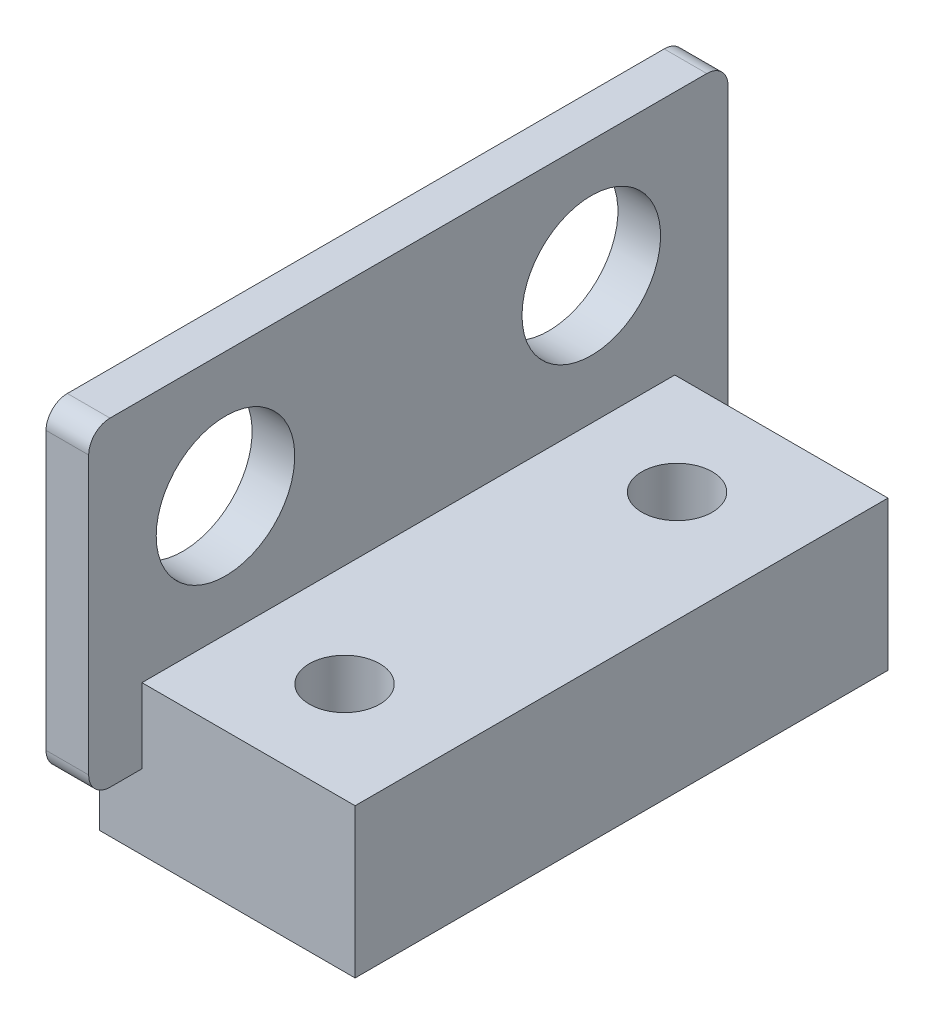
ISO-10303-21;
HEADER;
FILE_DESCRIPTION(('STEP AP214'),'2;1');
FILE_NAME('part.step','',(''),(''),'','','');
FILE_SCHEMA(('AUTOMOTIVE_DESIGN { 1 0 10303 214 1 1 1 1 }'));
ENDSEC;
DATA;
#1=APPLICATION_CONTEXT('core data for automotive mechanical design processes');
#2=APPLICATION_PROTOCOL_DEFINITION('international standard','automotive_design',2000,#1);
#3=PRODUCT_CONTEXT('',#1,'mechanical');
#4=PRODUCT('Part','Part','',(#3));
#5=PRODUCT_RELATED_PRODUCT_CATEGORY('part','',(#4));
#6=PRODUCT_DEFINITION_FORMATION('','',#4);
#7=PRODUCT_DEFINITION_CONTEXT('part definition',#1,'design');
#8=PRODUCT_DEFINITION('design','',#6,#7);
#9=PRODUCT_DEFINITION_SHAPE('','',#8);
#10=(LENGTH_UNIT() NAMED_UNIT(*) SI_UNIT(.MILLI.,.METRE.));
#11=(NAMED_UNIT(*) PLANE_ANGLE_UNIT() SI_UNIT($,.RADIAN.));
#12=(NAMED_UNIT(*) SI_UNIT($,.STERADIAN.) SOLID_ANGLE_UNIT());
#13=UNCERTAINTY_MEASURE_WITH_UNIT(LENGTH_MEASURE(1.E-05),#10,'distance_accuracy_value','');
#14=(GEOMETRIC_REPRESENTATION_CONTEXT(3) GLOBAL_UNCERTAINTY_ASSIGNED_CONTEXT((#13)) GLOBAL_UNIT_ASSIGNED_CONTEXT((#10,
#11,#12)) REPRESENTATION_CONTEXT('',''));
#15=CARTESIAN_POINT('',(0.,0.,0.));
#16=DIRECTION('',(0.,0.,1.));
#17=DIRECTION('',(1.,0.,0.));
#18=AXIS2_PLACEMENT_3D('',#15,#16,#17);
#19=CARTESIAN_POINT('',(0.804958277186399,3.5,7.80000000000001));
#20=DIRECTION('',(0.,-1.,0.));
#21=DIRECTION('',(0.,0.,-1.));
#22=AXIS2_PLACEMENT_3D('',#19,#20,#21);
#23=CYLINDRICAL_SURFACE('',#22,1.65);
#24=CARTESIAN_POINT('',(0.804958277186399,3.5,7.80000000000001));
#25=DIRECTION('',(0.,1.,0.));
#26=DIRECTION('',(0.,0.,1.));
#27=AXIS2_PLACEMENT_3D('',#24,#25,#26);
#28=CIRCLE('',#27,1.65);
#29=CARTESIAN_POINT('',(0.804958277186399,3.5,9.45));
#30=VERTEX_POINT('',#29);
#31=EDGE_CURVE('E392',#30,#30,#28,.T.);
#32=ORIENTED_EDGE('',*,*,#31,.T.);
#33=EDGE_LOOP('',(#32));
#34=FACE_BOUND('',#33,.T.);
#35=CARTESIAN_POINT('',(0.804958277186399,0.,7.80000000000001));
#36=DIRECTION('',(0.,-1.,0.));
#37=DIRECTION('',(0.,0.,-1.));
#38=AXIS2_PLACEMENT_3D('',#35,#36,#37);
#39=CIRCLE('',#38,1.65);
#40=CARTESIAN_POINT('',(0.804958277186399,0.,6.15));
#41=VERTEX_POINT('',#40);
#42=EDGE_CURVE('E393',#41,#41,#39,.T.);
#43=ORIENTED_EDGE('',*,*,#42,.T.);
#44=EDGE_LOOP('',(#43));
#45=FACE_BOUND('',#44,.T.);
#46=ADVANCED_FACE('F34',(#34,#45),#23,.F.);
#47=CARTESIAN_POINT('',(0.804958277186399,3.5,-7.80000000000001));
#48=DIRECTION('',(0.,-1.,0.));
#49=DIRECTION('',(0.,0.,-1.));
#50=AXIS2_PLACEMENT_3D('',#47,#48,#49);
#51=CYLINDRICAL_SURFACE('',#50,1.65);
#52=CARTESIAN_POINT('',(0.804958277186399,3.5,-7.80000000000001));
#53=DIRECTION('',(0.,1.,0.));
#54=DIRECTION('',(0.,0.,-1.));
#55=AXIS2_PLACEMENT_3D('',#52,#53,#54);
#56=CIRCLE('',#55,1.65);
#57=CARTESIAN_POINT('',(0.804958277186399,3.5,-9.45));
#58=VERTEX_POINT('',#57);
#59=EDGE_CURVE('E389',#58,#58,#56,.T.);
#60=ORIENTED_EDGE('',*,*,#59,.T.);
#61=EDGE_LOOP('',(#60));
#62=FACE_BOUND('',#61,.T.);
#63=CARTESIAN_POINT('',(0.804958277186399,0.,-7.80000000000001));
#64=DIRECTION('',(0.,-1.,0.));
#65=DIRECTION('',(0.,0.,-1.));
#66=AXIS2_PLACEMENT_3D('',#63,#64,#65);
#67=CIRCLE('',#66,1.65);
#68=CARTESIAN_POINT('',(0.804958277186399,0.,-9.45));
#69=VERTEX_POINT('',#68);
#70=EDGE_CURVE('E332',#69,#69,#67,.T.);
#71=ORIENTED_EDGE('',*,*,#70,.T.);
#72=EDGE_LOOP('',(#71));
#73=FACE_BOUND('',#72,.T.);
#74=ADVANCED_FACE('F507',(#62,#73),#51,.F.);
#75=CARTESIAN_POINT('',(0.,3.5,0.));
#76=DIRECTION('',(0.,1.,0.));
#77=DIRECTION('',(0.,0.,1.));
#78=AXIS2_PLACEMENT_3D('',#75,#76,#77);
#79=PLANE('',#78);
#80=DIRECTION('',(0.,0.,-1.));
#81=VECTOR('',#80,1.);
#82=CARTESIAN_POINT('',(-4.,3.5,0.));
#83=LINE('',#82,#81);
#84=CARTESIAN_POINT('',(-4.,3.5,12.5));
#85=VERTEX_POINT('',#84);
#86=CARTESIAN_POINT('',(-4.,3.5,-12.5));
#87=VERTEX_POINT('',#86);
#88=EDGE_CURVE('E276',#85,#87,#83,.T.);
#89=ORIENTED_EDGE('',*,*,#88,.F.);
#90=DIRECTION('',(1.,0.,0.));
#91=VECTOR('',#90,1.);
#92=CARTESIAN_POINT('',(-6.,3.5,12.5));
#93=LINE('',#92,#91);
#94=CARTESIAN_POINT('',(6.,3.5,12.5));
#95=VERTEX_POINT('',#94);
#96=EDGE_CURVE('E403',#85,#95,#93,.T.);
#97=ORIENTED_EDGE('',*,*,#96,.T.);
#98=DIRECTION('',(0.,0.,-1.));
#99=VECTOR('',#98,1.);
#100=CARTESIAN_POINT('',(6.,3.5,-12.5));
#101=LINE('',#100,#99);
#102=CARTESIAN_POINT('',(6.,3.5,-12.5));
#103=VERTEX_POINT('',#102);
#104=EDGE_CURVE('E397',#95,#103,#101,.T.);
#105=ORIENTED_EDGE('',*,*,#104,.T.);
#106=DIRECTION('',(-1.,0.,0.));
#107=VECTOR('',#106,1.);
#108=CARTESIAN_POINT('',(-6.,3.5,-12.5));
#109=LINE('',#108,#107);
#110=EDGE_CURVE('E400',#103,#87,#109,.T.);
#111=ORIENTED_EDGE('',*,*,#110,.T.);
#112=EDGE_LOOP('',(#89,#97,#105,#111));
#113=FACE_BOUND('',#112,.T.);
#114=ORIENTED_EDGE('',*,*,#31,.F.);
#115=EDGE_LOOP('',(#114));
#116=FACE_BOUND('',#115,.T.);
#117=ORIENTED_EDGE('',*,*,#59,.F.);
#118=EDGE_LOOP('',(#117));
#119=FACE_BOUND('',#118,.T.);
#120=ADVANCED_FACE('F433',(#113,#116,#119),#79,.T.);
#121=CARTESIAN_POINT('',(0.,-3.5,0.));
#122=DIRECTION('',(0.,1.,0.));
#123=DIRECTION('',(0.,0.,1.));
#124=AXIS2_PLACEMENT_3D('',#121,#122,#123);
#125=PLANE('',#124);
#126=DIRECTION('',(0.499999999999999,0.,0.866025403784439));
#127=VECTOR('',#126,1.);
#128=CARTESIAN_POINT('',(2.6524791385932,-3.5,4.60000000000001));
#129=LINE('',#128,#127);
#130=CARTESIAN_POINT('',(2.6524791385932,-3.5,4.60000000000001));
#131=VERTEX_POINT('',#130);
#132=CARTESIAN_POINT('',(4.5,-3.5,7.80000000000001));
#133=VERTEX_POINT('',#132);
#134=EDGE_CURVE('E315',#131,#133,#129,.T.);
#135=ORIENTED_EDGE('',*,*,#134,.F.);
#136=DIRECTION('',(1.,0.,0.));
#137=VECTOR('',#136,1.);
#138=CARTESIAN_POINT('',(-1.04256258422037,-3.5,4.59999999999999));
#139=LINE('',#138,#137);
#140=CARTESIAN_POINT('',(-1.04256258422037,-3.5,4.59999999999999));
#141=VERTEX_POINT('',#140);
#142=EDGE_CURVE('E313',#141,#131,#139,.T.);
#143=ORIENTED_EDGE('',*,*,#142,.F.);
#144=DIRECTION('',(0.500000000000009,0.,-0.866025403784433));
#145=VECTOR('',#144,1.);
#146=CARTESIAN_POINT('',(-2.8900834456272,-3.5,7.79999999999997));
#147=LINE('',#146,#145);
#148=CARTESIAN_POINT('',(-2.8900834456272,-3.5,7.79999999999997));
#149=VERTEX_POINT('',#148);
#150=EDGE_CURVE('E297',#149,#141,#147,.T.);
#151=ORIENTED_EDGE('',*,*,#150,.F.);
#152=DIRECTION('',(-0.499999999999993,0.,-0.866025403784443));
#153=VECTOR('',#152,1.);
#154=CARTESIAN_POINT('',(-1.04256258422042,-3.5,11.));
#155=LINE('',#154,#153);
#156=CARTESIAN_POINT('',(-1.04256258422042,-3.5,11.));
#157=VERTEX_POINT('',#156);
#158=EDGE_CURVE('E325',#157,#149,#155,.T.);
#159=ORIENTED_EDGE('',*,*,#158,.F.);
#160=DIRECTION('',(-1.,0.,0.));
#161=VECTOR('',#160,1.);
#162=CARTESIAN_POINT('',(2.65247913859319,-3.5,11.));
#163=LINE('',#162,#161);
#164=CARTESIAN_POINT('',(2.65247913859319,-3.5,11.));
#165=VERTEX_POINT('',#164);
#166=EDGE_CURVE('E322',#165,#157,#163,.T.);
#167=ORIENTED_EDGE('',*,*,#166,.F.);
#168=DIRECTION('',(-0.500000000000003,0.,0.866025403784437));
#169=VECTOR('',#168,1.);
#170=CARTESIAN_POINT('',(4.5,-3.5,7.80000000000001));
#171=LINE('',#170,#169);
#172=EDGE_CURVE('E319',#133,#165,#171,.T.);
#173=ORIENTED_EDGE('',*,*,#172,.F.);
#174=EDGE_LOOP('',(#135,#143,#151,#159,#167,#173));
#175=FACE_BOUND('',#174,.T.);
#176=DIRECTION('',(0.499999999999999,0.,0.866025403784439));
#177=VECTOR('',#176,1.);
#178=CARTESIAN_POINT('',(2.6524791385932,-3.5,-11.));
#179=LINE('',#178,#177);
#180=CARTESIAN_POINT('',(2.6524791385932,-3.5,-11.));
#181=VERTEX_POINT('',#180);
#182=CARTESIAN_POINT('',(4.5,-3.5,-7.8));
#183=VERTEX_POINT('',#182);
#184=EDGE_CURVE('E364',#181,#183,#179,.T.);
#185=ORIENTED_EDGE('',*,*,#184,.F.);
#186=DIRECTION('',(1.,0.,0.));
#187=VECTOR('',#186,1.);
#188=CARTESIAN_POINT('',(-1.04256258422036,-3.5,-11.));
#189=LINE('',#188,#187);
#190=CARTESIAN_POINT('',(-1.04256258422036,-3.5,-11.));
#191=VERTEX_POINT('',#190);
#192=EDGE_CURVE('E292',#191,#181,#189,.T.);
#193=ORIENTED_EDGE('',*,*,#192,.F.);
#194=DIRECTION('',(0.500000000000009,0.,-0.866025403784433));
#195=VECTOR('',#194,1.);
#196=CARTESIAN_POINT('',(-2.8900834456272,-3.5,-7.80000000000004));
#197=LINE('',#196,#195);
#198=CARTESIAN_POINT('',(-2.8900834456272,-3.5,-7.80000000000004));
#199=VERTEX_POINT('',#198);
#200=EDGE_CURVE('E347',#199,#191,#197,.T.);
#201=ORIENTED_EDGE('',*,*,#200,.F.);
#202=DIRECTION('',(-0.499999999999993,0.,-0.866025403784443));
#203=VECTOR('',#202,1.);
#204=CARTESIAN_POINT('',(-1.04256258422042,-3.5,-4.60000000000002));
#205=LINE('',#204,#203);
#206=CARTESIAN_POINT('',(-1.04256258422042,-3.5,-4.60000000000002));
#207=VERTEX_POINT('',#206);
#208=EDGE_CURVE('E373',#207,#199,#205,.T.);
#209=ORIENTED_EDGE('',*,*,#208,.F.);
#210=DIRECTION('',(-1.,0.,0.));
#211=VECTOR('',#210,1.);
#212=CARTESIAN_POINT('',(2.65247913859319,-3.5,-4.6));
#213=LINE('',#212,#211);
#214=CARTESIAN_POINT('',(2.65247913859319,-3.5,-4.6));
#215=VERTEX_POINT('',#214);
#216=EDGE_CURVE('E370',#215,#207,#213,.T.);
#217=ORIENTED_EDGE('',*,*,#216,.F.);
#218=DIRECTION('',(-0.500000000000003,0.,0.866025403784437));
#219=VECTOR('',#218,1.);
#220=CARTESIAN_POINT('',(4.5,-3.5,-7.8));
#221=LINE('',#220,#219);
#222=EDGE_CURVE('E367',#183,#215,#221,.T.);
#223=ORIENTED_EDGE('',*,*,#222,.F.);
#224=EDGE_LOOP('',(#185,#193,#201,#209,#217,#223));
#225=FACE_BOUND('',#224,.T.);
#226=DIRECTION('',(0.,0.,-1.));
#227=VECTOR('',#226,1.);
#228=CARTESIAN_POINT('',(6.,-3.5,-12.5));
#229=LINE('',#228,#227);
#230=CARTESIAN_POINT('',(6.,-3.5,12.5));
#231=VERTEX_POINT('',#230);
#232=CARTESIAN_POINT('',(6.,-3.5,-12.5));
#233=VERTEX_POINT('',#232);
#234=EDGE_CURVE('E396',#231,#233,#229,.T.);
#235=ORIENTED_EDGE('',*,*,#234,.F.);
#236=DIRECTION('',(1.,0.,0.));
#237=VECTOR('',#236,1.);
#238=CARTESIAN_POINT('',(-6.,-3.5,12.5));
#239=LINE('',#238,#237);
#240=CARTESIAN_POINT('',(-6.,-3.5,12.5));
#241=VERTEX_POINT('',#240);
#242=EDGE_CURVE('E401',#241,#231,#239,.T.);
#243=ORIENTED_EDGE('',*,*,#242,.F.);
#244=DIRECTION('',(0.,0.,1.));
#245=VECTOR('',#244,1.);
#246=CARTESIAN_POINT('',(-6.,-3.5,-12.5));
#247=LINE('',#246,#245);
#248=CARTESIAN_POINT('',(-6.,-3.5,-12.5));
#249=VERTEX_POINT('',#248);
#250=EDGE_CURVE('E411',#249,#241,#247,.T.);
#251=ORIENTED_EDGE('',*,*,#250,.F.);
#252=DIRECTION('',(-1.,0.,0.));
#253=VECTOR('',#252,1.);
#254=CARTESIAN_POINT('',(-6.,-3.5,-12.5));
#255=LINE('',#254,#253);
#256=EDGE_CURVE('E408',#233,#249,#255,.T.);
#257=ORIENTED_EDGE('',*,*,#256,.F.);
#258=EDGE_LOOP('',(#235,#243,#251,#257));
#259=FACE_BOUND('',#258,.T.);
#260=ADVANCED_FACE('F443',(#175,#225,#259),#125,.F.);
#261=CARTESIAN_POINT('',(6.,3.5,-12.5));
#262=DIRECTION('',(-1.,0.,0.));
#263=DIRECTION('',(0.,0.,1.));
#264=AXIS2_PLACEMENT_3D('',#261,#262,#263);
#265=PLANE('',#264);
#266=ORIENTED_EDGE('',*,*,#234,.T.);
#267=DIRECTION('',(0.,-1.,0.));
#268=VECTOR('',#267,1.);
#269=CARTESIAN_POINT('',(6.,3.5,-12.5));
#270=LINE('',#269,#268);
#271=EDGE_CURVE('E421',#103,#233,#270,.T.);
#272=ORIENTED_EDGE('',*,*,#271,.F.);
#273=ORIENTED_EDGE('',*,*,#104,.F.);
#274=DIRECTION('',(0.,-1.,0.));
#275=VECTOR('',#274,1.);
#276=CARTESIAN_POINT('',(6.,3.5,12.5));
#277=LINE('',#276,#275);
#278=EDGE_CURVE('E405',#95,#231,#277,.T.);
#279=ORIENTED_EDGE('',*,*,#278,.T.);
#280=EDGE_LOOP('',(#266,#272,#273,#279));
#281=FACE_BOUND('',#280,.T.);
#282=ADVANCED_FACE('F36',(#281),#265,.F.);
#283=CARTESIAN_POINT('',(-6.,3.5,-12.5));
#284=DIRECTION('',(0.,0.,1.));
#285=DIRECTION('',(1.,0.,0.));
#286=AXIS2_PLACEMENT_3D('',#283,#284,#285);
#287=PLANE('',#286);
#288=DIRECTION('',(0.,-1.,0.));
#289=VECTOR('',#288,1.);
#290=CARTESIAN_POINT('',(-6.,3.5,-12.5));
#291=LINE('',#290,#289);
#292=CARTESIAN_POINT('',(-6.,0.,-12.5));
#293=VERTEX_POINT('',#292);
#294=EDGE_CURVE('E419',#293,#249,#291,.T.);
#295=ORIENTED_EDGE('',*,*,#294,.F.);
#296=DIRECTION('',(1.,0.,0.));
#297=VECTOR('',#296,1.);
#298=CARTESIAN_POINT('',(-6.,0.,-12.5));
#299=LINE('',#298,#297);
#300=CARTESIAN_POINT('',(-4.,0.,-12.5));
#301=VERTEX_POINT('',#300);
#302=EDGE_CURVE('E49',#293,#301,#299,.T.);
#303=ORIENTED_EDGE('',*,*,#302,.T.);
#304=DIRECTION('',(0.,1.,0.));
#305=VECTOR('',#304,1.);
#306=CARTESIAN_POINT('',(-4.,3.5,-12.5));
#307=LINE('',#306,#305);
#308=EDGE_CURVE('E53',#301,#87,#307,.T.);
#309=ORIENTED_EDGE('',*,*,#308,.T.);
#310=ORIENTED_EDGE('',*,*,#110,.F.);
#311=ORIENTED_EDGE('',*,*,#271,.T.);
#312=ORIENTED_EDGE('',*,*,#256,.T.);
#313=EDGE_LOOP('',(#295,#303,#309,#310,#311,#312));
#314=FACE_BOUND('',#313,.T.);
#315=ADVANCED_FACE('F437',(#314),#287,.F.);
#316=CARTESIAN_POINT('',(-6.,3.5,-12.5));
#317=DIRECTION('',(1.,0.,0.));
#318=DIRECTION('',(0.,0.,-1.));
#319=AXIS2_PLACEMENT_3D('',#316,#317,#318);
#320=PLANE('',#319);
#321=DIRECTION('',(0.,0.,1.));
#322=VECTOR('',#321,1.);
#323=CARTESIAN_POINT('',(-6.,0.,0.));
#324=LINE('',#323,#322);
#325=CARTESIAN_POINT('',(-6.,0.,-14.));
#326=VERTEX_POINT('',#325);
#327=EDGE_CURVE('E251',#326,#293,#324,.T.);
#328=ORIENTED_EDGE('',*,*,#327,.T.);
#329=ORIENTED_EDGE('',*,*,#294,.T.);
#330=ORIENTED_EDGE('',*,*,#250,.T.);
#331=DIRECTION('',(0.,-1.,0.));
#332=VECTOR('',#331,1.);
#333=CARTESIAN_POINT('',(-6.,3.5,12.5));
#334=LINE('',#333,#332);
#335=CARTESIAN_POINT('',(-6.,0.,12.5));
#336=VERTEX_POINT('',#335);
#337=EDGE_CURVE('E417',#336,#241,#334,.T.);
#338=ORIENTED_EDGE('',*,*,#337,.F.);
#339=CARTESIAN_POINT('',(-6.,0.,14.));
#340=VERTEX_POINT('',#339);
#341=EDGE_CURVE('E254',#336,#340,#324,.T.);
#342=ORIENTED_EDGE('',*,*,#341,.T.);
#343=CARTESIAN_POINT('',(-6.,1.,14.));
#344=DIRECTION('',(-1.,0.,0.));
#345=DIRECTION('',(0.,0.,1.));
#346=AXIS2_PLACEMENT_3D('',#343,#344,#345);
#347=CIRCLE('',#346,1.);
#348=CARTESIAN_POINT('',(-6.,1.,15.));
#349=VERTEX_POINT('',#348);
#350=EDGE_CURVE('E223',#340,#349,#347,.T.);
#351=ORIENTED_EDGE('',*,*,#350,.T.);
#352=DIRECTION('',(0.,1.,0.));
#353=VECTOR('',#352,1.);
#354=CARTESIAN_POINT('',(-6.,14.,15.));
#355=LINE('',#354,#353);
#356=CARTESIAN_POINT('',(-6.,14.,15.));
#357=VERTEX_POINT('',#356);
#358=EDGE_CURVE('E256',#349,#357,#355,.T.);
#359=ORIENTED_EDGE('',*,*,#358,.T.);
#360=CARTESIAN_POINT('',(-6.,14.,14.));
#361=DIRECTION('',(-1.,0.,0.));
#362=DIRECTION('',(0.,0.,-1.));
#363=AXIS2_PLACEMENT_3D('',#360,#361,#362);
#364=CIRCLE('',#363,0.999999999999999);
#365=CARTESIAN_POINT('',(-6.,15.,14.));
#366=VERTEX_POINT('',#365);
#367=EDGE_CURVE('E259',#357,#366,#364,.T.);
#368=ORIENTED_EDGE('',*,*,#367,.T.);
#369=DIRECTION('',(0.,0.,-1.));
#370=VECTOR('',#369,1.);
#371=CARTESIAN_POINT('',(-6.,15.,-14.));
#372=LINE('',#371,#370);
#373=CARTESIAN_POINT('',(-6.,15.,-14.));
#374=VERTEX_POINT('',#373);
#375=EDGE_CURVE('E262',#366,#374,#372,.T.);
#376=ORIENTED_EDGE('',*,*,#375,.T.);
#377=CARTESIAN_POINT('',(-6.,14.,-14.));
#378=DIRECTION('',(-1.,0.,0.));
#379=DIRECTION('',(0.,0.,-1.));
#380=AXIS2_PLACEMENT_3D('',#377,#378,#379);
#381=CIRCLE('',#380,0.999999999999999);
#382=CARTESIAN_POINT('',(-6.,14.,-15.));
#383=VERTEX_POINT('',#382);
#384=EDGE_CURVE('E265',#374,#383,#381,.T.);
#385=ORIENTED_EDGE('',*,*,#384,.T.);
#386=DIRECTION('',(0.,-1.,0.));
#387=VECTOR('',#386,1.);
#388=CARTESIAN_POINT('',(-6.,1.00000000000001,-15.));
#389=LINE('',#388,#387);
#390=CARTESIAN_POINT('',(-6.,1.00000000000001,-15.));
#391=VERTEX_POINT('',#390);
#392=EDGE_CURVE('E268',#383,#391,#389,.T.);
#393=ORIENTED_EDGE('',*,*,#392,.T.);
#394=CARTESIAN_POINT('',(-6.,0.999999999999998,-14.));
#395=DIRECTION('',(-1.,0.,0.));
#396=DIRECTION('',(0.,0.,-1.));
#397=AXIS2_PLACEMENT_3D('',#394,#395,#396);
#398=CIRCLE('',#397,1.);
#399=EDGE_CURVE('E216',#391,#326,#398,.T.);
#400=ORIENTED_EDGE('',*,*,#399,.T.);
#401=EDGE_LOOP('',(#328,#329,#330,#338,#342,#351,#359,#368,#376,#385,#393,#400));
#402=FACE_BOUND('',#401,.T.);
#403=CARTESIAN_POINT('',(-6.,9.12493936450424,8.58119784648299));
#404=DIRECTION('',(-1.,0.,0.));
#405=DIRECTION('',(0.,0.,1.));
#406=AXIS2_PLACEMENT_3D('',#403,#404,#405);
#407=CIRCLE('',#406,3.25);
#408=CARTESIAN_POINT('',(-6.,9.12493936450424,11.831197846483));
#409=VERTEX_POINT('',#408);
#410=EDGE_CURVE('E480',#409,#409,#407,.T.);
#411=ORIENTED_EDGE('',*,*,#410,.F.);
#412=EDGE_LOOP('',(#411));
#413=FACE_BOUND('',#412,.T.);
#414=CARTESIAN_POINT('',(-6.,9.5,-8.581197846483));
#415=DIRECTION('',(-1.,0.,0.));
#416=DIRECTION('',(0.,0.,1.));
#417=AXIS2_PLACEMENT_3D('',#414,#415,#416);
#418=CIRCLE('',#417,3.25);
#419=CARTESIAN_POINT('',(-6.,9.5,-5.331197846483));
#420=VERTEX_POINT('',#419);
#421=EDGE_CURVE('E473',#420,#420,#418,.T.);
#422=ORIENTED_EDGE('',*,*,#421,.F.);
#423=EDGE_LOOP('',(#422));
#424=FACE_BOUND('',#423,.T.);
#425=ADVANCED_FACE('F445',(#402,#413,#424),#320,.F.);
#426=CARTESIAN_POINT('',(-6.,3.5,12.5));
#427=DIRECTION('',(0.,0.,-1.));
#428=DIRECTION('',(-1.,0.,0.));
#429=AXIS2_PLACEMENT_3D('',#426,#427,#428);
#430=PLANE('',#429);
#431=DIRECTION('',(0.,-1.,0.));
#432=VECTOR('',#431,1.);
#433=CARTESIAN_POINT('',(-4.,3.5,12.5));
#434=LINE('',#433,#432);
#435=CARTESIAN_POINT('',(-4.,0.,12.5));
#436=VERTEX_POINT('',#435);
#437=EDGE_CURVE('E42',#85,#436,#434,.T.);
#438=ORIENTED_EDGE('',*,*,#437,.T.);
#439=DIRECTION('',(-1.,0.,0.));
#440=VECTOR('',#439,1.);
#441=CARTESIAN_POINT('',(-6.,0.,12.5));
#442=LINE('',#441,#440);
#443=EDGE_CURVE('E11',#436,#336,#442,.T.);
#444=ORIENTED_EDGE('',*,*,#443,.T.);
#445=ORIENTED_EDGE('',*,*,#337,.T.);
#446=ORIENTED_EDGE('',*,*,#242,.T.);
#447=ORIENTED_EDGE('',*,*,#278,.F.);
#448=ORIENTED_EDGE('',*,*,#96,.F.);
#449=EDGE_LOOP('',(#438,#444,#445,#446,#447,#448));
#450=FACE_BOUND('',#449,.T.);
#451=ADVANCED_FACE('F429',(#450),#430,.F.);
#452=CARTESIAN_POINT('',(-1.04256258422036,0.,-11.));
#453=DIRECTION('',(0.,0.,-1.));
#454=DIRECTION('',(-1.,0.,0.));
#455=AXIS2_PLACEMENT_3D('',#452,#453,#454);
#456=PLANE('',#455);
#457=ORIENTED_EDGE('',*,*,#192,.T.);
#458=DIRECTION('',(0.,-1.,0.));
#459=VECTOR('',#458,1.);
#460=CARTESIAN_POINT('',(2.6524791385932,0.,-11.));
#461=LINE('',#460,#459);
#462=CARTESIAN_POINT('',(2.6524791385932,0.,-11.));
#463=VERTEX_POINT('',#462);
#464=EDGE_CURVE('E362',#463,#181,#461,.T.);
#465=ORIENTED_EDGE('',*,*,#464,.F.);
#466=DIRECTION('',(1.,0.,0.));
#467=VECTOR('',#466,1.);
#468=CARTESIAN_POINT('',(-1.04256258422036,0.,-11.));
#469=LINE('',#468,#467);
#470=CARTESIAN_POINT('',(-1.04256258422036,0.,-11.));
#471=VERTEX_POINT('',#470);
#472=EDGE_CURVE('E343',#471,#463,#469,.T.);
#473=ORIENTED_EDGE('',*,*,#472,.F.);
#474=DIRECTION('',(0.,-1.,0.));
#475=VECTOR('',#474,1.);
#476=CARTESIAN_POINT('',(-1.04256258422036,0.,-11.));
#477=LINE('',#476,#475);
#478=EDGE_CURVE('E316',#471,#191,#477,.T.);
#479=ORIENTED_EDGE('',*,*,#478,.T.);
#480=EDGE_LOOP('',(#457,#465,#473,#479));
#481=FACE_BOUND('',#480,.T.);
#482=ADVANCED_FACE('F524',(#481),#456,.F.);
#483=CARTESIAN_POINT('',(-2.8900834456272,0.,-7.80000000000004));
#484=DIRECTION('',(-0.866025403784433,0.,-0.500000000000009));
#485=DIRECTION('',(-0.500000000000009,0.,0.866025403784433));
#486=AXIS2_PLACEMENT_3D('',#483,#484,#485);
#487=PLANE('',#486);
#488=ORIENTED_EDGE('',*,*,#200,.T.);
#489=ORIENTED_EDGE('',*,*,#478,.F.);
#490=DIRECTION('',(0.500000000000009,0.,-0.866025403784433));
#491=VECTOR('',#490,1.);
#492=CARTESIAN_POINT('',(-2.8900834456272,0.,-7.80000000000004));
#493=LINE('',#492,#491);
#494=CARTESIAN_POINT('',(-2.8900834456272,0.,-7.80000000000004));
#495=VERTEX_POINT('',#494);
#496=EDGE_CURVE('E359',#495,#471,#493,.T.);
#497=ORIENTED_EDGE('',*,*,#496,.F.);
#498=DIRECTION('',(0.,-1.,0.));
#499=VECTOR('',#498,1.);
#500=CARTESIAN_POINT('',(-2.8900834456272,0.,-7.80000000000004));
#501=LINE('',#500,#499);
#502=EDGE_CURVE('E379',#495,#199,#501,.T.);
#503=ORIENTED_EDGE('',*,*,#502,.T.);
#504=EDGE_LOOP('',(#488,#489,#497,#503));
#505=FACE_BOUND('',#504,.T.);
#506=ADVANCED_FACE('F559',(#505),#487,.F.);
#507=CARTESIAN_POINT('',(-1.04256258422042,0.,-4.60000000000002));
#508=DIRECTION('',(-0.866025403784443,0.,0.499999999999993));
#509=DIRECTION('',(0.499999999999993,0.,0.866025403784443));
#510=AXIS2_PLACEMENT_3D('',#507,#508,#509);
#511=PLANE('',#510);
#512=ORIENTED_EDGE('',*,*,#208,.T.);
#513=ORIENTED_EDGE('',*,*,#502,.F.);
#514=DIRECTION('',(-0.499999999999993,0.,-0.866025403784443));
#515=VECTOR('',#514,1.);
#516=CARTESIAN_POINT('',(-1.04256258422042,0.,-4.60000000000002));
#517=LINE('',#516,#515);
#518=CARTESIAN_POINT('',(-1.04256258422042,0.,-4.60000000000002));
#519=VERTEX_POINT('',#518);
#520=EDGE_CURVE('E356',#519,#495,#517,.T.);
#521=ORIENTED_EDGE('',*,*,#520,.F.);
#522=DIRECTION('',(0.,-1.,0.));
#523=VECTOR('',#522,1.);
#524=CARTESIAN_POINT('',(-1.04256258422042,0.,-4.60000000000002));
#525=LINE('',#524,#523);
#526=EDGE_CURVE('E381',#519,#207,#525,.T.);
#527=ORIENTED_EDGE('',*,*,#526,.T.);
#528=EDGE_LOOP('',(#512,#513,#521,#527));
#529=FACE_BOUND('',#528,.T.);
#530=ADVANCED_FACE('F567',(#529),#511,.F.);
#531=CARTESIAN_POINT('',(2.65247913859319,0.,-4.6));
#532=DIRECTION('',(0.,0.,1.));
#533=DIRECTION('',(1.,0.,0.));
#534=AXIS2_PLACEMENT_3D('',#531,#532,#533);
#535=PLANE('',#534);
#536=ORIENTED_EDGE('',*,*,#216,.T.);
#537=ORIENTED_EDGE('',*,*,#526,.F.);
#538=DIRECTION('',(-1.,0.,0.));
#539=VECTOR('',#538,1.);
#540=CARTESIAN_POINT('',(2.65247913859319,0.,-4.6));
#541=LINE('',#540,#539);
#542=CARTESIAN_POINT('',(2.65247913859319,0.,-4.6));
#543=VERTEX_POINT('',#542);
#544=EDGE_CURVE('E353',#543,#519,#541,.T.);
#545=ORIENTED_EDGE('',*,*,#544,.F.);
#546=DIRECTION('',(0.,-1.,0.));
#547=VECTOR('',#546,1.);
#548=CARTESIAN_POINT('',(2.65247913859319,0.,-4.6));
#549=LINE('',#548,#547);
#550=EDGE_CURVE('E383',#543,#215,#549,.T.);
#551=ORIENTED_EDGE('',*,*,#550,.T.);
#552=EDGE_LOOP('',(#536,#537,#545,#551));
#553=FACE_BOUND('',#552,.T.);
#554=ADVANCED_FACE('F576',(#553),#535,.F.);
#555=CARTESIAN_POINT('',(4.5,0.,-7.8));
#556=DIRECTION('',(0.866025403784437,0.,0.500000000000003));
#557=DIRECTION('',(0.500000000000003,0.,-0.866025403784437));
#558=AXIS2_PLACEMENT_3D('',#555,#556,#557);
#559=PLANE('',#558);
#560=ORIENTED_EDGE('',*,*,#222,.T.);
#561=ORIENTED_EDGE('',*,*,#550,.F.);
#562=DIRECTION('',(-0.500000000000003,0.,0.866025403784437));
#563=VECTOR('',#562,1.);
#564=CARTESIAN_POINT('',(4.5,0.,-7.8));
#565=LINE('',#564,#563);
#566=CARTESIAN_POINT('',(4.5,0.,-7.8));
#567=VERTEX_POINT('',#566);
#568=EDGE_CURVE('E350',#567,#543,#565,.T.);
#569=ORIENTED_EDGE('',*,*,#568,.F.);
#570=DIRECTION('',(0.,-1.,0.));
#571=VECTOR('',#570,1.);
#572=CARTESIAN_POINT('',(4.5,0.,-7.8));
#573=LINE('',#572,#571);
#574=EDGE_CURVE('E385',#567,#183,#573,.T.);
#575=ORIENTED_EDGE('',*,*,#574,.T.);
#576=EDGE_LOOP('',(#560,#561,#569,#575));
#577=FACE_BOUND('',#576,.T.);
#578=ADVANCED_FACE('F585',(#577),#559,.F.);
#579=CARTESIAN_POINT('',(2.6524791385932,0.,-11.));
#580=DIRECTION('',(0.866025403784439,0.,-0.499999999999999));
#581=DIRECTION('',(-0.499999999999999,0.,-0.866025403784439));
#582=AXIS2_PLACEMENT_3D('',#579,#580,#581);
#583=PLANE('',#582);
#584=ORIENTED_EDGE('',*,*,#184,.T.);
#585=ORIENTED_EDGE('',*,*,#574,.F.);
#586=DIRECTION('',(0.499999999999999,0.,0.866025403784439));
#587=VECTOR('',#586,1.);
#588=CARTESIAN_POINT('',(2.6524791385932,0.,-11.));
#589=LINE('',#588,#587);
#590=EDGE_CURVE('E346',#463,#567,#589,.T.);
#591=ORIENTED_EDGE('',*,*,#590,.F.);
#592=ORIENTED_EDGE('',*,*,#464,.T.);
#593=EDGE_LOOP('',(#584,#585,#591,#592));
#594=FACE_BOUND('',#593,.T.);
#595=ADVANCED_FACE('F594',(#594),#583,.F.);
#596=CARTESIAN_POINT('',(0.,0.,0.));
#597=DIRECTION('',(0.,-1.,0.));
#598=DIRECTION('',(0.,0.,-1.));
#599=AXIS2_PLACEMENT_3D('',#596,#597,#598);
#600=PLANE('',#599);
#601=ORIENTED_EDGE('',*,*,#70,.F.);
#602=EDGE_LOOP('',(#601));
#603=FACE_BOUND('',#602,.T.);
#604=ORIENTED_EDGE('',*,*,#472,.T.);
#605=ORIENTED_EDGE('',*,*,#590,.T.);
#606=ORIENTED_EDGE('',*,*,#568,.T.);
#607=ORIENTED_EDGE('',*,*,#544,.T.);
#608=ORIENTED_EDGE('',*,*,#520,.T.);
#609=ORIENTED_EDGE('',*,*,#496,.T.);
#610=EDGE_LOOP('',(#604,#605,#606,#607,#608,#609));
#611=FACE_BOUND('',#610,.T.);
#612=ADVANCED_FACE('F603',(#603,#611),#600,.T.);
#613=CARTESIAN_POINT('',(-1.04256258422037,0.,4.59999999999999));
#614=DIRECTION('',(0.,0.,-1.));
#615=DIRECTION('',(-1.,0.,0.));
#616=AXIS2_PLACEMENT_3D('',#613,#614,#615);
#617=PLANE('',#616);
#618=ORIENTED_EDGE('',*,*,#142,.T.);
#619=DIRECTION('',(0.,-1.,0.));
#620=VECTOR('',#619,1.);
#621=CARTESIAN_POINT('',(2.6524791385932,0.,4.60000000000001));
#622=LINE('',#621,#620);
#623=CARTESIAN_POINT('',(2.6524791385932,0.,4.60000000000001));
#624=VERTEX_POINT('',#623);
#625=EDGE_CURVE('E312',#624,#131,#622,.T.);
#626=ORIENTED_EDGE('',*,*,#625,.F.);
#627=DIRECTION('',(1.,0.,0.));
#628=VECTOR('',#627,1.);
#629=CARTESIAN_POINT('',(-1.04256258422037,0.,4.59999999999999));
#630=LINE('',#629,#628);
#631=CARTESIAN_POINT('',(-1.04256258422037,0.,4.59999999999999));
#632=VERTEX_POINT('',#631);
#633=EDGE_CURVE('E293',#632,#624,#630,.T.);
#634=ORIENTED_EDGE('',*,*,#633,.F.);
#635=DIRECTION('',(0.,-1.,0.));
#636=VECTOR('',#635,1.);
#637=CARTESIAN_POINT('',(-1.04256258422037,0.,4.59999999999999));
#638=LINE('',#637,#636);
#639=EDGE_CURVE('E330',#632,#141,#638,.T.);
#640=ORIENTED_EDGE('',*,*,#639,.T.);
#641=EDGE_LOOP('',(#618,#626,#634,#640));
#642=FACE_BOUND('',#641,.T.);
#643=ADVANCED_FACE('F612',(#642),#617,.F.);
#644=CARTESIAN_POINT('',(-2.8900834456272,0.,7.79999999999997));
#645=DIRECTION('',(-0.866025403784434,0.,-0.500000000000009));
#646=DIRECTION('',(-0.500000000000009,0.,0.866025403784434));
#647=AXIS2_PLACEMENT_3D('',#644,#645,#646);
#648=PLANE('',#647);
#649=ORIENTED_EDGE('',*,*,#150,.T.);
#650=ORIENTED_EDGE('',*,*,#639,.F.);
#651=DIRECTION('',(0.500000000000009,0.,-0.866025403784433));
#652=VECTOR('',#651,1.);
#653=CARTESIAN_POINT('',(-2.8900834456272,0.,7.79999999999997));
#654=LINE('',#653,#652);
#655=CARTESIAN_POINT('',(-2.8900834456272,0.,7.79999999999997));
#656=VERTEX_POINT('',#655);
#657=EDGE_CURVE('E309',#656,#632,#654,.T.);
#658=ORIENTED_EDGE('',*,*,#657,.F.);
#659=DIRECTION('',(0.,-1.,0.));
#660=VECTOR('',#659,1.);
#661=CARTESIAN_POINT('',(-2.8900834456272,0.,7.79999999999997));
#662=LINE('',#661,#660);
#663=EDGE_CURVE('E333',#656,#149,#662,.T.);
#664=ORIENTED_EDGE('',*,*,#663,.T.);
#665=EDGE_LOOP('',(#649,#650,#658,#664));
#666=FACE_BOUND('',#665,.T.);
#667=ADVANCED_FACE('F621',(#666),#648,.F.);
#668=CARTESIAN_POINT('',(-1.04256258422042,0.,11.));
#669=DIRECTION('',(-0.866025403784443,0.,0.499999999999993));
#670=DIRECTION('',(0.499999999999993,0.,0.866025403784443));
#671=AXIS2_PLACEMENT_3D('',#668,#669,#670);
#672=PLANE('',#671);
#673=ORIENTED_EDGE('',*,*,#158,.T.);
#674=ORIENTED_EDGE('',*,*,#663,.F.);
#675=DIRECTION('',(-0.499999999999993,0.,-0.866025403784443));
#676=VECTOR('',#675,1.);
#677=CARTESIAN_POINT('',(-1.04256258422042,0.,11.));
#678=LINE('',#677,#676);
#679=CARTESIAN_POINT('',(-1.04256258422042,0.,11.));
#680=VERTEX_POINT('',#679);
#681=EDGE_CURVE('E306',#680,#656,#678,.T.);
#682=ORIENTED_EDGE('',*,*,#681,.F.);
#683=DIRECTION('',(0.,-1.,0.));
#684=VECTOR('',#683,1.);
#685=CARTESIAN_POINT('',(-1.04256258422042,0.,11.));
#686=LINE('',#685,#684);
#687=EDGE_CURVE('E335',#680,#157,#686,.T.);
#688=ORIENTED_EDGE('',*,*,#687,.T.);
#689=EDGE_LOOP('',(#673,#674,#682,#688));
#690=FACE_BOUND('',#689,.T.);
#691=ADVANCED_FACE('F630',(#690),#672,.F.);
#692=CARTESIAN_POINT('',(2.65247913859319,0.,11.));
#693=DIRECTION('',(0.,0.,1.));
#694=DIRECTION('',(1.,0.,0.));
#695=AXIS2_PLACEMENT_3D('',#692,#693,#694);
#696=PLANE('',#695);
#697=ORIENTED_EDGE('',*,*,#166,.T.);
#698=ORIENTED_EDGE('',*,*,#687,.F.);
#699=DIRECTION('',(-1.,0.,0.));
#700=VECTOR('',#699,1.);
#701=CARTESIAN_POINT('',(2.65247913859319,0.,11.));
#702=LINE('',#701,#700);
#703=CARTESIAN_POINT('',(2.65247913859319,0.,11.));
#704=VERTEX_POINT('',#703);
#705=EDGE_CURVE('E303',#704,#680,#702,.T.);
#706=ORIENTED_EDGE('',*,*,#705,.F.);
#707=DIRECTION('',(0.,-1.,0.));
#708=VECTOR('',#707,1.);
#709=CARTESIAN_POINT('',(2.65247913859319,0.,11.));
#710=LINE('',#709,#708);
#711=EDGE_CURVE('E337',#704,#165,#710,.T.);
#712=ORIENTED_EDGE('',*,*,#711,.T.);
#713=EDGE_LOOP('',(#697,#698,#706,#712));
#714=FACE_BOUND('',#713,.T.);
#715=ADVANCED_FACE('F639',(#714),#696,.F.);
#716=CARTESIAN_POINT('',(4.5,0.,7.80000000000001));
#717=DIRECTION('',(0.866025403784437,0.,0.500000000000003));
#718=DIRECTION('',(0.500000000000003,0.,-0.866025403784437));
#719=AXIS2_PLACEMENT_3D('',#716,#717,#718);
#720=PLANE('',#719);
#721=ORIENTED_EDGE('',*,*,#172,.T.);
#722=ORIENTED_EDGE('',*,*,#711,.F.);
#723=DIRECTION('',(-0.500000000000003,0.,0.866025403784437));
#724=VECTOR('',#723,1.);
#725=CARTESIAN_POINT('',(4.5,0.,7.80000000000001));
#726=LINE('',#725,#724);
#727=CARTESIAN_POINT('',(4.5,0.,7.80000000000001));
#728=VERTEX_POINT('',#727);
#729=EDGE_CURVE('E300',#728,#704,#726,.T.);
#730=ORIENTED_EDGE('',*,*,#729,.F.);
#731=DIRECTION('',(0.,-1.,0.));
#732=VECTOR('',#731,1.);
#733=CARTESIAN_POINT('',(4.5,0.,7.80000000000001));
#734=LINE('',#733,#732);
#735=EDGE_CURVE('E339',#728,#133,#734,.T.);
#736=ORIENTED_EDGE('',*,*,#735,.T.);
#737=EDGE_LOOP('',(#721,#722,#730,#736));
#738=FACE_BOUND('',#737,.T.);
#739=ADVANCED_FACE('F648',(#738),#720,.F.);
#740=CARTESIAN_POINT('',(2.6524791385932,0.,4.60000000000001));
#741=DIRECTION('',(0.866025403784439,0.,-0.499999999999999));
#742=DIRECTION('',(-0.499999999999999,0.,-0.866025403784439));
#743=AXIS2_PLACEMENT_3D('',#740,#741,#742);
#744=PLANE('',#743);
#745=ORIENTED_EDGE('',*,*,#134,.T.);
#746=ORIENTED_EDGE('',*,*,#735,.F.);
#747=DIRECTION('',(0.499999999999999,0.,0.866025403784439));
#748=VECTOR('',#747,1.);
#749=CARTESIAN_POINT('',(2.6524791385932,0.,4.60000000000001));
#750=LINE('',#749,#748);
#751=EDGE_CURVE('E296',#624,#728,#750,.T.);
#752=ORIENTED_EDGE('',*,*,#751,.F.);
#753=ORIENTED_EDGE('',*,*,#625,.T.);
#754=EDGE_LOOP('',(#745,#746,#752,#753));
#755=FACE_BOUND('',#754,.T.);
#756=ADVANCED_FACE('F657',(#755),#744,.F.);
#757=CARTESIAN_POINT('',(0.,0.,0.));
#758=DIRECTION('',(0.,-1.,0.));
#759=DIRECTION('',(0.,0.,-1.));
#760=AXIS2_PLACEMENT_3D('',#757,#758,#759);
#761=PLANE('',#760);
#762=ORIENTED_EDGE('',*,*,#42,.F.);
#763=EDGE_LOOP('',(#762));
#764=FACE_BOUND('',#763,.T.);
#765=ORIENTED_EDGE('',*,*,#633,.T.);
#766=ORIENTED_EDGE('',*,*,#751,.T.);
#767=ORIENTED_EDGE('',*,*,#729,.T.);
#768=ORIENTED_EDGE('',*,*,#705,.T.);
#769=ORIENTED_EDGE('',*,*,#681,.T.);
#770=ORIENTED_EDGE('',*,*,#657,.T.);
#771=EDGE_LOOP('',(#765,#766,#767,#768,#769,#770));
#772=FACE_BOUND('',#771,.T.);
#773=ADVANCED_FACE('F666',(#764,#772),#761,.T.);
#774=CARTESIAN_POINT('',(-4.,0.,0.));
#775=DIRECTION('',(0.,-1.,0.));
#776=DIRECTION('',(0.,0.,-1.));
#777=AXIS2_PLACEMENT_3D('',#774,#775,#776);
#778=PLANE('',#777);
#779=ORIENTED_EDGE('',*,*,#302,.F.);
#780=ORIENTED_EDGE('',*,*,#327,.F.);
#781=DIRECTION('',(-1.,0.,0.));
#782=VECTOR('',#781,1.);
#783=CARTESIAN_POINT('',(-4.,0.,-14.));
#784=LINE('',#783,#782);
#785=CARTESIAN_POINT('',(-4.,0.,-14.));
#786=VERTEX_POINT('',#785);
#787=EDGE_CURVE('E273',#786,#326,#784,.T.);
#788=ORIENTED_EDGE('',*,*,#787,.F.);
#789=DIRECTION('',(0.,0.,1.));
#790=VECTOR('',#789,1.);
#791=CARTESIAN_POINT('',(-4.,0.,0.));
#792=LINE('',#791,#790);
#793=EDGE_CURVE('E215',#786,#301,#792,.T.);
#794=ORIENTED_EDGE('',*,*,#793,.T.);
#795=EDGE_LOOP('',(#779,#780,#788,#794));
#796=FACE_BOUND('',#795,.T.);
#797=ADVANCED_FACE('F448',(#796),#778,.T.);
#798=ORIENTED_EDGE('',*,*,#443,.F.);
#799=CARTESIAN_POINT('',(-4.,0.,14.));
#800=VERTEX_POINT('',#799);
#801=EDGE_CURVE('E206',#436,#800,#792,.T.);
#802=ORIENTED_EDGE('',*,*,#801,.T.);
#803=DIRECTION('',(-1.,0.,0.));
#804=VECTOR('',#803,1.);
#805=CARTESIAN_POINT('',(-4.,0.,14.));
#806=LINE('',#805,#804);
#807=EDGE_CURVE('E210',#800,#340,#806,.T.);
#808=ORIENTED_EDGE('',*,*,#807,.T.);
#809=ORIENTED_EDGE('',*,*,#341,.F.);
#810=EDGE_LOOP('',(#798,#802,#808,#809));
#811=FACE_BOUND('',#810,.T.);
#812=ADVANCED_FACE('F208',(#811),#778,.T.);
#813=CARTESIAN_POINT('',(-4.,0.999999999999998,-14.));
#814=DIRECTION('',(1.,0.,0.));
#815=DIRECTION('',(0.,0.,-1.));
#816=AXIS2_PLACEMENT_3D('',#813,#814,#815);
#817=PLANE('',#816);
#818=CARTESIAN_POINT('',(-4.,9.5,-8.581197846483));
#819=DIRECTION('',(-1.,0.,0.));
#820=DIRECTION('',(0.,0.,1.));
#821=AXIS2_PLACEMENT_3D('',#818,#819,#820);
#822=CIRCLE('',#821,3.25);
#823=CARTESIAN_POINT('',(-4.,9.5,-5.331197846483));
#824=VERTEX_POINT('',#823);
#825=EDGE_CURVE('E471',#824,#824,#822,.T.);
#826=ORIENTED_EDGE('',*,*,#825,.T.);
#827=EDGE_LOOP('',(#826));
#828=FACE_BOUND('',#827,.T.);
#829=CARTESIAN_POINT('',(-4.,9.12493936450424,8.58119784648299));
#830=DIRECTION('',(-1.,0.,0.));
#831=DIRECTION('',(0.,0.,1.));
#832=AXIS2_PLACEMENT_3D('',#829,#830,#831);
#833=CIRCLE('',#832,3.25);
#834=CARTESIAN_POINT('',(-4.,9.12493936450424,11.831197846483));
#835=VERTEX_POINT('',#834);
#836=EDGE_CURVE('E478',#835,#835,#833,.T.);
#837=ORIENTED_EDGE('',*,*,#836,.T.);
#838=EDGE_LOOP('',(#837));
#839=FACE_BOUND('',#838,.T.);
#840=ORIENTED_EDGE('',*,*,#308,.F.);
#841=ORIENTED_EDGE('',*,*,#793,.F.);
#842=CARTESIAN_POINT('',(-4.,0.999999999999998,-14.));
#843=DIRECTION('',(-1.,0.,0.));
#844=DIRECTION('',(0.,0.,-1.));
#845=AXIS2_PLACEMENT_3D('',#842,#843,#844);
#846=CIRCLE('',#845,1.);
#847=CARTESIAN_POINT('',(-4.,1.00000000000001,-15.));
#848=VERTEX_POINT('',#847);
#849=EDGE_CURVE('E225',#848,#786,#846,.T.);
#850=ORIENTED_EDGE('',*,*,#849,.F.);
#851=DIRECTION('',(0.,-1.,0.));
#852=VECTOR('',#851,1.);
#853=CARTESIAN_POINT('',(-4.,1.00000000000001,-15.));
#854=LINE('',#853,#852);
#855=CARTESIAN_POINT('',(-4.,14.,-15.));
#856=VERTEX_POINT('',#855);
#857=EDGE_CURVE('E246',#856,#848,#854,.T.);
#858=ORIENTED_EDGE('',*,*,#857,.F.);
#859=CARTESIAN_POINT('',(-4.,14.,-14.));
#860=DIRECTION('',(-1.,0.,0.));
#861=DIRECTION('',(0.,0.,-1.));
#862=AXIS2_PLACEMENT_3D('',#859,#860,#861);
#863=CIRCLE('',#862,0.999999999999999);
#864=CARTESIAN_POINT('',(-4.,15.,-14.));
#865=VERTEX_POINT('',#864);
#866=EDGE_CURVE('E243',#865,#856,#863,.T.);
#867=ORIENTED_EDGE('',*,*,#866,.F.);
#868=DIRECTION('',(0.,0.,-1.));
#869=VECTOR('',#868,1.);
#870=CARTESIAN_POINT('',(-4.,15.,-14.));
#871=LINE('',#870,#869);
#872=CARTESIAN_POINT('',(-4.,15.,14.));
#873=VERTEX_POINT('',#872);
#874=EDGE_CURVE('E240',#873,#865,#871,.T.);
#875=ORIENTED_EDGE('',*,*,#874,.F.);
#876=CARTESIAN_POINT('',(-4.,14.,14.));
#877=DIRECTION('',(-1.,0.,0.));
#878=DIRECTION('',(0.,0.,-1.));
#879=AXIS2_PLACEMENT_3D('',#876,#877,#878);
#880=CIRCLE('',#879,0.999999999999999);
#881=CARTESIAN_POINT('',(-4.,14.,15.));
#882=VERTEX_POINT('',#881);
#883=EDGE_CURVE('E233',#882,#873,#880,.T.);
#884=ORIENTED_EDGE('',*,*,#883,.F.);
#885=DIRECTION('',(0.,1.,0.));
#886=VECTOR('',#885,1.);
#887=CARTESIAN_POINT('',(-4.,14.,15.));
#888=LINE('',#887,#886);
#889=CARTESIAN_POINT('',(-4.,1.,15.));
#890=VERTEX_POINT('',#889);
#891=EDGE_CURVE('E231',#890,#882,#888,.T.);
#892=ORIENTED_EDGE('',*,*,#891,.F.);
#893=CARTESIAN_POINT('',(-4.,1.,14.));
#894=DIRECTION('',(-1.,0.,0.));
#895=DIRECTION('',(0.,0.,1.));
#896=AXIS2_PLACEMENT_3D('',#893,#894,#895);
#897=CIRCLE('',#896,1.);
#898=EDGE_CURVE('E221',#800,#890,#897,.T.);
#899=ORIENTED_EDGE('',*,*,#898,.F.);
#900=ORIENTED_EDGE('',*,*,#801,.F.);
#901=ORIENTED_EDGE('',*,*,#437,.F.);
#902=ORIENTED_EDGE('',*,*,#88,.T.);
#903=EDGE_LOOP('',(#840,#841,#850,#858,#867,#875,#884,#892,#899,#900,#901,#902));
#904=FACE_BOUND('',#903,.T.);
#905=ADVANCED_FACE('F228',(#828,#839,#904),#817,.T.);
#906=CARTESIAN_POINT('',(-4.,0.999999999999998,-14.));
#907=DIRECTION('',(-1.,0.,0.));
#908=DIRECTION('',(0.,0.,1.));
#909=AXIS2_PLACEMENT_3D('',#906,#907,#908);
#910=CYLINDRICAL_SURFACE('',#909,1.);
#911=ORIENTED_EDGE('',*,*,#399,.F.);
#912=DIRECTION('',(-1.,0.,0.));
#913=VECTOR('',#912,1.);
#914=CARTESIAN_POINT('',(-4.,1.00000000000001,-15.));
#915=LINE('',#914,#913);
#916=EDGE_CURVE('E277',#848,#391,#915,.T.);
#917=ORIENTED_EDGE('',*,*,#916,.F.);
#918=ORIENTED_EDGE('',*,*,#849,.T.);
#919=ORIENTED_EDGE('',*,*,#787,.T.);
#920=EDGE_LOOP('',(#911,#917,#918,#919));
#921=FACE_BOUND('',#920,.T.);
#922=ADVANCED_FACE('F453',(#921),#910,.T.);
#923=CARTESIAN_POINT('',(-4.,1.00000000000001,-15.));
#924=DIRECTION('',(0.,0.,-1.));
#925=DIRECTION('',(-1.,0.,0.));
#926=AXIS2_PLACEMENT_3D('',#923,#924,#925);
#927=PLANE('',#926);
#928=ORIENTED_EDGE('',*,*,#392,.F.);
#929=DIRECTION('',(-1.,0.,0.));
#930=VECTOR('',#929,1.);
#931=CARTESIAN_POINT('',(-4.,14.,-15.));
#932=LINE('',#931,#930);
#933=EDGE_CURVE('E279',#856,#383,#932,.T.);
#934=ORIENTED_EDGE('',*,*,#933,.F.);
#935=ORIENTED_EDGE('',*,*,#857,.T.);
#936=ORIENTED_EDGE('',*,*,#916,.T.);
#937=EDGE_LOOP('',(#928,#934,#935,#936));
#938=FACE_BOUND('',#937,.T.);
#939=ADVANCED_FACE('F456',(#938),#927,.T.);
#940=CARTESIAN_POINT('',(-4.,14.,-14.));
#941=DIRECTION('',(-1.,0.,0.));
#942=DIRECTION('',(0.,0.,1.));
#943=AXIS2_PLACEMENT_3D('',#940,#941,#942);
#944=CYLINDRICAL_SURFACE('',#943,0.999999999999999);
#945=ORIENTED_EDGE('',*,*,#384,.F.);
#946=DIRECTION('',(-1.,0.,0.));
#947=VECTOR('',#946,1.);
#948=CARTESIAN_POINT('',(-4.,15.,-14.));
#949=LINE('',#948,#947);
#950=EDGE_CURVE('E281',#865,#374,#949,.T.);
#951=ORIENTED_EDGE('',*,*,#950,.F.);
#952=ORIENTED_EDGE('',*,*,#866,.T.);
#953=ORIENTED_EDGE('',*,*,#933,.T.);
#954=EDGE_LOOP('',(#945,#951,#952,#953));
#955=FACE_BOUND('',#954,.T.);
#956=ADVANCED_FACE('F461',(#955),#944,.T.);
#957=CARTESIAN_POINT('',(-4.,15.,-14.));
#958=DIRECTION('',(0.,1.,0.));
#959=DIRECTION('',(0.,0.,1.));
#960=AXIS2_PLACEMENT_3D('',#957,#958,#959);
#961=PLANE('',#960);
#962=ORIENTED_EDGE('',*,*,#375,.F.);
#963=DIRECTION('',(-1.,0.,0.));
#964=VECTOR('',#963,1.);
#965=CARTESIAN_POINT('',(-4.,15.,14.));
#966=LINE('',#965,#964);
#967=EDGE_CURVE('E283',#873,#366,#966,.T.);
#968=ORIENTED_EDGE('',*,*,#967,.F.);
#969=ORIENTED_EDGE('',*,*,#874,.T.);
#970=ORIENTED_EDGE('',*,*,#950,.T.);
#971=EDGE_LOOP('',(#962,#968,#969,#970));
#972=FACE_BOUND('',#971,.T.);
#973=ADVANCED_FACE('F464',(#972),#961,.T.);
#974=CARTESIAN_POINT('',(-4.,14.,14.));
#975=DIRECTION('',(-1.,0.,0.));
#976=DIRECTION('',(0.,0.,1.));
#977=AXIS2_PLACEMENT_3D('',#974,#975,#976);
#978=CYLINDRICAL_SURFACE('',#977,0.999999999999999);
#979=ORIENTED_EDGE('',*,*,#367,.F.);
#980=DIRECTION('',(-1.,0.,0.));
#981=VECTOR('',#980,1.);
#982=CARTESIAN_POINT('',(-4.,14.,15.));
#983=LINE('',#982,#981);
#984=EDGE_CURVE('E285',#882,#357,#983,.T.);
#985=ORIENTED_EDGE('',*,*,#984,.F.);
#986=ORIENTED_EDGE('',*,*,#883,.T.);
#987=ORIENTED_EDGE('',*,*,#967,.T.);
#988=EDGE_LOOP('',(#979,#985,#986,#987));
#989=FACE_BOUND('',#988,.T.);
#990=ADVANCED_FACE('F467',(#989),#978,.T.);
#991=CARTESIAN_POINT('',(-4.,14.,15.));
#992=DIRECTION('',(0.,0.,1.));
#993=DIRECTION('',(1.,0.,0.));
#994=AXIS2_PLACEMENT_3D('',#991,#992,#993);
#995=PLANE('',#994);
#996=ORIENTED_EDGE('',*,*,#358,.F.);
#997=DIRECTION('',(-1.,0.,0.));
#998=VECTOR('',#997,1.);
#999=CARTESIAN_POINT('',(-4.,1.,15.));
#1000=LINE('',#999,#998);
#1001=EDGE_CURVE('E224',#890,#349,#1000,.T.);
#1002=ORIENTED_EDGE('',*,*,#1001,.F.);
#1003=ORIENTED_EDGE('',*,*,#891,.T.);
#1004=ORIENTED_EDGE('',*,*,#984,.T.);
#1005=EDGE_LOOP('',(#996,#1002,#1003,#1004));
#1006=FACE_BOUND('',#1005,.T.);
#1007=ADVANCED_FACE('F470',(#1006),#995,.T.);
#1008=CARTESIAN_POINT('',(-4.,1.,14.));
#1009=DIRECTION('',(-1.,0.,0.));
#1010=DIRECTION('',(0.,0.,1.));
#1011=AXIS2_PLACEMENT_3D('',#1008,#1009,#1010);
#1012=CYLINDRICAL_SURFACE('',#1011,1.);
#1013=ORIENTED_EDGE('',*,*,#350,.F.);
#1014=ORIENTED_EDGE('',*,*,#807,.F.);
#1015=ORIENTED_EDGE('',*,*,#898,.T.);
#1016=ORIENTED_EDGE('',*,*,#1001,.T.);
#1017=EDGE_LOOP('',(#1013,#1014,#1015,#1016));
#1018=FACE_BOUND('',#1017,.T.);
#1019=ADVANCED_FACE('F220',(#1018),#1012,.T.);
#1020=CARTESIAN_POINT('',(-4.,9.5,-8.581197846483));
#1021=DIRECTION('',(-1.,0.,0.));
#1022=DIRECTION('',(0.,0.,1.));
#1023=AXIS2_PLACEMENT_3D('',#1020,#1021,#1022);
#1024=CYLINDRICAL_SURFACE('',#1023,3.25);
#1025=ORIENTED_EDGE('',*,*,#825,.F.);
#1026=EDGE_LOOP('',(#1025));
#1027=FACE_BOUND('',#1026,.T.);
#1028=ORIENTED_EDGE('',*,*,#421,.T.);
#1029=EDGE_LOOP('',(#1028));
#1030=FACE_BOUND('',#1029,.T.);
#1031=ADVANCED_FACE('F490',(#1027,#1030),#1024,.F.);
#1032=CARTESIAN_POINT('',(-4.,9.12493936450424,8.58119784648299));
#1033=DIRECTION('',(-1.,0.,0.));
#1034=DIRECTION('',(0.,0.,1.));
#1035=AXIS2_PLACEMENT_3D('',#1032,#1033,#1034);
#1036=CYLINDRICAL_SURFACE('',#1035,3.25);
#1037=ORIENTED_EDGE('',*,*,#836,.F.);
#1038=EDGE_LOOP('',(#1037));
#1039=FACE_BOUND('',#1038,.T.);
#1040=ORIENTED_EDGE('',*,*,#410,.T.);
#1041=EDGE_LOOP('',(#1040));
#1042=FACE_BOUND('',#1041,.T.);
#1043=ADVANCED_FACE('F487',(#1039,#1042),#1036,.F.);
#1044=CLOSED_SHELL('',(#46,#74,#120,#260,#282,#315,#425,#451,#482,#506,#530,#554,#578,#595,#612,
#643,#667,#691,#715,#739,#756,#773,#797,#812,#905,#922,#939,#956,#973,#990,#1007,#1019,#1031,#1043));
#1045=MANIFOLD_SOLID_BREP('B2',#1044);
#1046=ADVANCED_BREP_SHAPE_REPRESENTATION('',(#18,#1045),#14);
#1047=SHAPE_DEFINITION_REPRESENTATION(#9,#1046);
ENDSEC;
END-ISO-10303-21;
